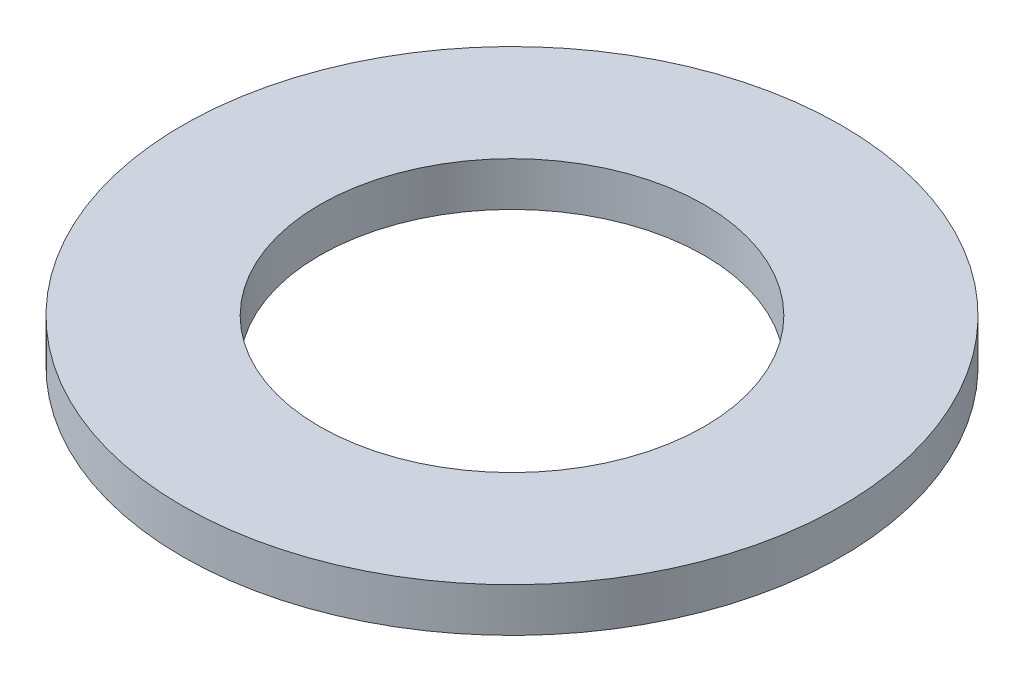
ISO-10303-21;
HEADER;
FILE_DESCRIPTION(('STEP AP214'),'2;1');
FILE_NAME('part.step','',(''),(''),'','','');
FILE_SCHEMA(('AUTOMOTIVE_DESIGN { 1 0 10303 214 1 1 1 1 }'));
ENDSEC;
DATA;
#1=APPLICATION_CONTEXT('core data for automotive mechanical design processes');
#2=APPLICATION_PROTOCOL_DEFINITION('international standard','automotive_design',2000,#1);
#3=PRODUCT_CONTEXT('',#1,'mechanical');
#4=PRODUCT('Part','Part','',(#3));
#5=PRODUCT_RELATED_PRODUCT_CATEGORY('part','',(#4));
#6=PRODUCT_DEFINITION_FORMATION('','',#4);
#7=PRODUCT_DEFINITION_CONTEXT('part definition',#1,'design');
#8=PRODUCT_DEFINITION('design','',#6,#7);
#9=PRODUCT_DEFINITION_SHAPE('','',#8);
#10=(LENGTH_UNIT() NAMED_UNIT(*) SI_UNIT(.MILLI.,.METRE.));
#11=(NAMED_UNIT(*) PLANE_ANGLE_UNIT() SI_UNIT($,.RADIAN.));
#12=(NAMED_UNIT(*) SI_UNIT($,.STERADIAN.) SOLID_ANGLE_UNIT());
#13=UNCERTAINTY_MEASURE_WITH_UNIT(LENGTH_MEASURE(1.E-05),#10,'distance_accuracy_value','');
#14=(GEOMETRIC_REPRESENTATION_CONTEXT(3) GLOBAL_UNCERTAINTY_ASSIGNED_CONTEXT((#13)) GLOBAL_UNIT_ASSIGNED_CONTEXT((#10,
#11,#12)) REPRESENTATION_CONTEXT('',''));
#15=CARTESIAN_POINT('',(0.,0.,0.));
#16=DIRECTION('',(0.,0.,1.));
#17=DIRECTION('',(1.,0.,0.));
#18=AXIS2_PLACEMENT_3D('',#15,#16,#17);
#19=CARTESIAN_POINT('',(0.,0.4,0.));
#20=DIRECTION('',(0.,1.,0.));
#21=DIRECTION('',(0.,0.,1.));
#22=AXIS2_PLACEMENT_3D('',#19,#20,#21);
#23=PLANE('',#22);
#24=CARTESIAN_POINT('',(0.,0.4,0.));
#25=DIRECTION('',(0.,1.,0.));
#26=DIRECTION('',(0.,0.,1.));
#27=AXIS2_PLACEMENT_3D('',#24,#25,#26);
#28=CIRCLE('',#27,3.);
#29=CARTESIAN_POINT('',(0.,0.4,3.));
#30=VERTEX_POINT('',#29);
#31=EDGE_CURVE('E10',#30,#30,#28,.T.);
#32=ORIENTED_EDGE('',*,*,#31,.T.);
#33=EDGE_LOOP('',(#32));
#34=FACE_BOUND('',#33,.T.);
#35=CARTESIAN_POINT('',(0.,0.4,0.));
#36=DIRECTION('',(0.,1.,0.));
#37=DIRECTION('',(0.,0.,1.));
#38=AXIS2_PLACEMENT_3D('',#35,#36,#37);
#39=CIRCLE('',#38,1.75);
#40=CARTESIAN_POINT('',(0.,0.4,1.75));
#41=VERTEX_POINT('',#40);
#42=EDGE_CURVE('E54',#41,#41,#39,.T.);
#43=ORIENTED_EDGE('',*,*,#42,.F.);
#44=EDGE_LOOP('',(#43));
#45=FACE_BOUND('',#44,.T.);
#46=ADVANCED_FACE('F43',(#34,#45),#23,.T.);
#47=CARTESIAN_POINT('',(0.,0.,0.));
#48=DIRECTION('',(0.,1.,0.));
#49=DIRECTION('',(0.,0.,1.));
#50=AXIS2_PLACEMENT_3D('',#47,#48,#49);
#51=PLANE('',#50);
#52=CARTESIAN_POINT('',(0.,0.,0.));
#53=DIRECTION('',(0.,1.,0.));
#54=DIRECTION('',(0.,0.,1.));
#55=AXIS2_PLACEMENT_3D('',#52,#53,#54);
#56=CIRCLE('',#55,3.);
#57=CARTESIAN_POINT('',(0.,0.,3.));
#58=VERTEX_POINT('',#57);
#59=EDGE_CURVE('E47',#58,#58,#56,.T.);
#60=ORIENTED_EDGE('',*,*,#59,.F.);
#61=EDGE_LOOP('',(#60));
#62=FACE_BOUND('',#61,.T.);
#63=CARTESIAN_POINT('',(0.,0.,0.));
#64=DIRECTION('',(0.,1.,0.));
#65=DIRECTION('',(0.,0.,1.));
#66=AXIS2_PLACEMENT_3D('',#63,#64,#65);
#67=CIRCLE('',#66,1.75);
#68=CARTESIAN_POINT('',(0.,0.,1.75));
#69=VERTEX_POINT('',#68);
#70=EDGE_CURVE('E56',#69,#69,#67,.T.);
#71=ORIENTED_EDGE('',*,*,#70,.T.);
#72=EDGE_LOOP('',(#71));
#73=FACE_BOUND('',#72,.T.);
#74=ADVANCED_FACE('F66',(#62,#73),#51,.F.);
#75=CARTESIAN_POINT('',(0.,0.4,0.));
#76=DIRECTION('',(0.,-1.,0.));
#77=DIRECTION('',(0.,0.,-1.));
#78=AXIS2_PLACEMENT_3D('',#75,#76,#77);
#79=CYLINDRICAL_SURFACE('',#78,3.);
#80=ORIENTED_EDGE('',*,*,#31,.F.);
#81=EDGE_LOOP('',(#80));
#82=FACE_BOUND('',#81,.T.);
#83=ORIENTED_EDGE('',*,*,#59,.T.);
#84=EDGE_LOOP('',(#83));
#85=FACE_BOUND('',#84,.T.);
#86=ADVANCED_FACE('F45',(#82,#85),#79,.T.);
#87=CARTESIAN_POINT('',(0.,0.4,0.));
#88=DIRECTION('',(0.,-1.,0.));
#89=DIRECTION('',(0.,0.,-1.));
#90=AXIS2_PLACEMENT_3D('',#87,#88,#89);
#91=CYLINDRICAL_SURFACE('',#90,1.75);
#92=ORIENTED_EDGE('',*,*,#42,.T.);
#93=EDGE_LOOP('',(#92));
#94=FACE_BOUND('',#93,.T.);
#95=ORIENTED_EDGE('',*,*,#70,.F.);
#96=EDGE_LOOP('',(#95));
#97=FACE_BOUND('',#96,.T.);
#98=ADVANCED_FACE('F62',(#94,#97),#91,.F.);
#99=CLOSED_SHELL('',(#46,#74,#86,#98));
#100=MANIFOLD_SOLID_BREP('B2',#99);
#101=ADVANCED_BREP_SHAPE_REPRESENTATION('',(#18,#100),#14);
#102=SHAPE_DEFINITION_REPRESENTATION(#9,#101);
ENDSEC;
END-ISO-10303-21;
